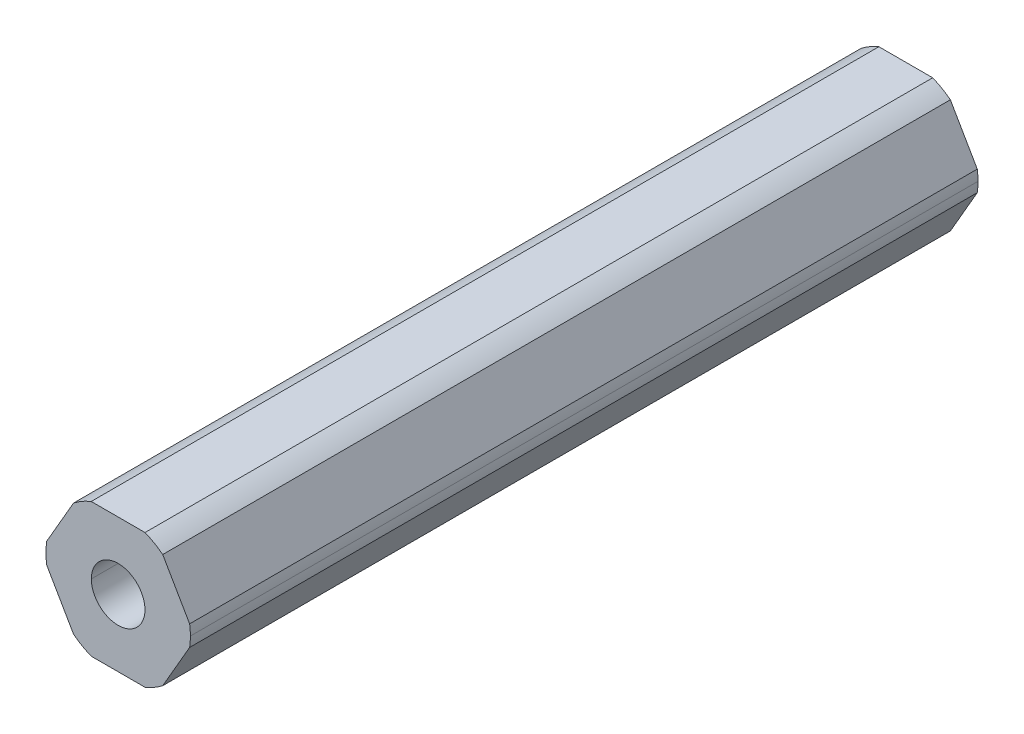
ISO-10303-21;
HEADER;
FILE_DESCRIPTION(('STEP AP214'),'2;1');
FILE_NAME('part.step','',(''),(''),'','','');
FILE_SCHEMA(('AUTOMOTIVE_DESIGN { 1 0 10303 214 1 1 1 1 }'));
ENDSEC;
DATA;
#1=APPLICATION_CONTEXT('core data for automotive mechanical design processes');
#2=APPLICATION_PROTOCOL_DEFINITION('international standard','automotive_design',2000,#1);
#3=PRODUCT_CONTEXT('',#1,'mechanical');
#4=PRODUCT('Part','Part','',(#3));
#5=PRODUCT_RELATED_PRODUCT_CATEGORY('part','',(#4));
#6=PRODUCT_DEFINITION_FORMATION('','',#4);
#7=PRODUCT_DEFINITION_CONTEXT('part definition',#1,'design');
#8=PRODUCT_DEFINITION('design','',#6,#7);
#9=PRODUCT_DEFINITION_SHAPE('','',#8);
#10=(LENGTH_UNIT() NAMED_UNIT(*) SI_UNIT(.MILLI.,.METRE.));
#11=(NAMED_UNIT(*) PLANE_ANGLE_UNIT() SI_UNIT($,.RADIAN.));
#12=(NAMED_UNIT(*) SI_UNIT($,.STERADIAN.) SOLID_ANGLE_UNIT());
#13=UNCERTAINTY_MEASURE_WITH_UNIT(LENGTH_MEASURE(1.E-05),#10,'distance_accuracy_value','');
#14=(GEOMETRIC_REPRESENTATION_CONTEXT(3) GLOBAL_UNCERTAINTY_ASSIGNED_CONTEXT((#13)) GLOBAL_UNIT_ASSIGNED_CONTEXT((#10,
#11,#12)) REPRESENTATION_CONTEXT('',''));
#15=CARTESIAN_POINT('',(0.,0.,0.));
#16=DIRECTION('',(0.,0.,1.));
#17=DIRECTION('',(1.,0.,0.));
#18=AXIS2_PLACEMENT_3D('',#15,#16,#17);
#19=CARTESIAN_POINT('',(0.,0.,-457.2));
#20=DIRECTION('',(0.,0.,1.));
#21=DIRECTION('',(1.,0.,0.));
#22=AXIS2_PLACEMENT_3D('',#19,#20,#21);
#23=CYLINDRICAL_SURFACE('',#22,2.55);
#24=CARTESIAN_POINT('',(0.,0.,-382.27));
#25=DIRECTION('',(0.,0.,1.));
#26=DIRECTION('',(1.,0.,0.));
#27=AXIS2_PLACEMENT_3D('',#24,#25,#26);
#28=CIRCLE('',#27,2.55);
#29=CARTESIAN_POINT('',(2.55,0.,-382.27));
#30=VERTEX_POINT('',#29);
#31=CARTESIAN_POINT('',(-2.55,0.,-382.27));
#32=VERTEX_POINT('',#31);
#33=EDGE_CURVE('E67',#30,#32,#28,.F.);
#34=ORIENTED_EDGE('',*,*,#33,.F.);
#35=DIRECTION('',(0.,0.,1.));
#36=VECTOR('',#35,1.);
#37=CARTESIAN_POINT('',(2.55,0.,-457.2));
#38=LINE('',#37,#36);
#39=CARTESIAN_POINT('',(2.55,0.,-457.2));
#40=VERTEX_POINT('',#39);
#41=EDGE_CURVE('E170',#40,#30,#38,.T.);
#42=ORIENTED_EDGE('',*,*,#41,.F.);
#43=CARTESIAN_POINT('',(0.,0.,-457.2));
#44=DIRECTION('',(0.,0.,1.));
#45=DIRECTION('',(1.,0.,0.));
#46=AXIS2_PLACEMENT_3D('',#43,#44,#45);
#47=CIRCLE('',#46,2.55);
#48=CARTESIAN_POINT('',(-2.55,0.,-457.2));
#49=VERTEX_POINT('',#48);
#50=EDGE_CURVE('E272',#49,#40,#47,.T.);
#51=ORIENTED_EDGE('',*,*,#50,.F.);
#52=DIRECTION('',(0.,0.,1.));
#53=VECTOR('',#52,1.);
#54=CARTESIAN_POINT('',(-2.55,0.,-457.2));
#55=LINE('',#54,#53);
#56=EDGE_CURVE('E54',#49,#32,#55,.T.);
#57=ORIENTED_EDGE('',*,*,#56,.T.);
#58=EDGE_LOOP('',(#34,#42,#51,#57));
#59=FACE_BOUND('',#58,.T.);
#60=ADVANCED_FACE('F46',(#59),#23,.F.);
#61=CARTESIAN_POINT('',(0.,0.,-457.2));
#62=DIRECTION('',(0.,0.,1.));
#63=DIRECTION('',(1.,0.,0.));
#64=AXIS2_PLACEMENT_3D('',#61,#62,#63);
#65=CYLINDRICAL_SURFACE('',#64,6.87);
#66=DIRECTION('',(0.,0.,1.));
#67=VECTOR('',#66,1.);
#68=CARTESIAN_POINT('',(6.87,0.,-457.2));
#69=LINE('',#68,#67);
#70=CARTESIAN_POINT('',(6.87,0.,-457.2));
#71=VERTEX_POINT('',#70);
#72=CARTESIAN_POINT('',(6.87,0.,-382.27));
#73=VERTEX_POINT('',#72);
#74=EDGE_CURVE('E219',#71,#73,#69,.T.);
#75=ORIENTED_EDGE('',*,*,#74,.T.);
#76=CARTESIAN_POINT('',(0.,0.,-382.27));
#77=DIRECTION('',(0.,0.,1.));
#78=DIRECTION('',(1.,0.,0.));
#79=AXIS2_PLACEMENT_3D('',#76,#77,#78);
#80=CIRCLE('',#79,6.87);
#81=CARTESIAN_POINT('',(6.80102150534208,-0.971085209378955,-382.27));
#82=VERTEX_POINT('',#81);
#83=EDGE_CURVE('E333',#73,#82,#80,.F.);
#84=ORIENTED_EDGE('',*,*,#83,.T.);
#85=DIRECTION('',(0.,0.,-1.));
#86=VECTOR('',#85,1.);
#87=CARTESIAN_POINT('',(6.80102150534208,-0.971085209378962,-457.2));
#88=LINE('',#87,#86);
#89=CARTESIAN_POINT('',(6.80102150534208,-0.971085209378955,-457.2));
#90=VERTEX_POINT('',#89);
#91=EDGE_CURVE('E222',#82,#90,#88,.T.);
#92=ORIENTED_EDGE('',*,*,#91,.T.);
#93=CARTESIAN_POINT('',(0.,0.,-457.2));
#94=DIRECTION('',(0.,0.,1.));
#95=DIRECTION('',(1.,0.,0.));
#96=AXIS2_PLACEMENT_3D('',#93,#94,#95);
#97=CIRCLE('',#96,6.87);
#98=EDGE_CURVE('E215',#90,#71,#97,.T.);
#99=ORIENTED_EDGE('',*,*,#98,.T.);
#100=EDGE_LOOP('',(#75,#84,#92,#99));
#101=FACE_BOUND('',#100,.T.);
#102=ADVANCED_FACE('F357',(#101),#65,.T.);
#103=CARTESIAN_POINT('',(3.68083890619154,-6.3754,457.2));
#104=DIRECTION('',(-0.866025403784439,0.5,0.));
#105=DIRECTION('',(0.,0.,1.));
#106=AXIS2_PLACEMENT_3D('',#103,#104,#105);
#107=PLANE('',#106);
#108=DIRECTION('',(0.5,0.866025403784439,0.));
#109=VECTOR('',#108,1.);
#110=CARTESIAN_POINT('',(3.68083890619154,-6.3754,-382.27));
#111=LINE('',#110,#109);
#112=CARTESIAN_POINT('',(4.24149521323254,-5.40431479062105,-382.27));
#113=VERTEX_POINT('',#112);
#114=EDGE_CURVE('E341',#113,#82,#111,.T.);
#115=ORIENTED_EDGE('',*,*,#114,.F.);
#116=DIRECTION('',(0.,0.,1.));
#117=VECTOR('',#116,1.);
#118=CARTESIAN_POINT('',(4.24149521323255,-5.40431479062104,-457.2));
#119=LINE('',#118,#117);
#120=CARTESIAN_POINT('',(4.24149521323254,-5.40431479062105,-457.2));
#121=VERTEX_POINT('',#120);
#122=EDGE_CURVE('E212',#121,#113,#119,.T.);
#123=ORIENTED_EDGE('',*,*,#122,.F.);
#124=DIRECTION('',(0.5,0.866025403784439,0.));
#125=VECTOR('',#124,1.);
#126=CARTESIAN_POINT('',(3.68083890619154,-6.3754,-457.2));
#127=LINE('',#126,#125);
#128=EDGE_CURVE('E240',#121,#90,#127,.T.);
#129=ORIENTED_EDGE('',*,*,#128,.T.);
#130=ORIENTED_EDGE('',*,*,#91,.F.);
#131=EDGE_LOOP('',(#115,#123,#129,#130));
#132=FACE_BOUND('',#131,.T.);
#133=ADVANCED_FACE('F355',(#132),#107,.F.);
#134=CARTESIAN_POINT('',(7.36167781238308,0.,457.2));
#135=DIRECTION('',(-0.866025403784439,-0.5,0.));
#136=DIRECTION('',(-0.5,0.866025403784439,0.));
#137=AXIS2_PLACEMENT_3D('',#134,#135,#136);
#138=PLANE('',#137);
#139=DIRECTION('',(-0.5,0.866025403784439,0.));
#140=VECTOR('',#139,1.);
#141=CARTESIAN_POINT('',(7.36167781238308,0.,-382.27));
#142=LINE('',#141,#140);
#143=CARTESIAN_POINT('',(6.80102150534208,0.97108520937895,-382.27));
#144=VERTEX_POINT('',#143);
#145=CARTESIAN_POINT('',(4.24149521323254,5.40431479062105,-382.27));
#146=VERTEX_POINT('',#145);
#147=EDGE_CURVE('E61',#144,#146,#142,.T.);
#148=ORIENTED_EDGE('',*,*,#147,.F.);
#149=DIRECTION('',(0.,0.,1.));
#150=VECTOR('',#149,1.);
#151=CARTESIAN_POINT('',(6.80102150534208,0.971085209378949,-457.2));
#152=LINE('',#151,#150);
#153=CARTESIAN_POINT('',(6.80102150534208,0.97108520937895,-457.2));
#154=VERTEX_POINT('',#153);
#155=EDGE_CURVE('E207',#154,#144,#152,.T.);
#156=ORIENTED_EDGE('',*,*,#155,.F.);
#157=DIRECTION('',(-0.5,0.866025403784439,0.));
#158=VECTOR('',#157,1.);
#159=CARTESIAN_POINT('',(7.36167781238308,0.,-457.2));
#160=LINE('',#159,#158);
#161=CARTESIAN_POINT('',(4.24149521323254,5.40431479062105,-457.2));
#162=VERTEX_POINT('',#161);
#163=EDGE_CURVE('E203',#154,#162,#160,.T.);
#164=ORIENTED_EDGE('',*,*,#163,.T.);
#165=DIRECTION('',(0.,0.,-1.));
#166=VECTOR('',#165,1.);
#167=CARTESIAN_POINT('',(4.24149521323254,5.40431479062105,-457.2));
#168=LINE('',#167,#166);
#169=EDGE_CURVE('E216',#146,#162,#168,.T.);
#170=ORIENTED_EDGE('',*,*,#169,.F.);
#171=EDGE_LOOP('',(#148,#156,#164,#170));
#172=FACE_BOUND('',#171,.T.);
#173=ADVANCED_FACE('F312',(#172),#138,.F.);
#174=CARTESIAN_POINT('',(3.68083890619154,6.3754,457.2));
#175=DIRECTION('',(0.,-1.,0.));
#176=DIRECTION('',(0.,0.,-1.));
#177=AXIS2_PLACEMENT_3D('',#174,#175,#176);
#178=PLANE('',#177);
#179=DIRECTION('',(-1.,0.,0.));
#180=VECTOR('',#179,1.);
#181=CARTESIAN_POINT('',(3.68083890619154,6.3754,-382.27));
#182=LINE('',#181,#180);
#183=CARTESIAN_POINT('',(2.55952629210953,6.3754,-382.27));
#184=VERTEX_POINT('',#183);
#185=CARTESIAN_POINT('',(-2.55952629210953,6.3754,-382.27));
#186=VERTEX_POINT('',#185);
#187=EDGE_CURVE('E321',#184,#186,#182,.T.);
#188=ORIENTED_EDGE('',*,*,#187,.F.);
#189=DIRECTION('',(0.,0.,1.));
#190=VECTOR('',#189,1.);
#191=CARTESIAN_POINT('',(2.55952629210952,6.3754,-457.2));
#192=LINE('',#191,#190);
#193=CARTESIAN_POINT('',(2.55952629210952,6.3754,-457.2));
#194=VERTEX_POINT('',#193);
#195=EDGE_CURVE('E179',#194,#184,#192,.T.);
#196=ORIENTED_EDGE('',*,*,#195,.F.);
#197=DIRECTION('',(-1.,0.,0.));
#198=VECTOR('',#197,1.);
#199=CARTESIAN_POINT('',(3.68083890619154,6.3754,-457.2));
#200=LINE('',#199,#198);
#201=CARTESIAN_POINT('',(-2.55952629210953,6.3754,-457.2));
#202=VERTEX_POINT('',#201);
#203=EDGE_CURVE('E199',#194,#202,#200,.T.);
#204=ORIENTED_EDGE('',*,*,#203,.T.);
#205=DIRECTION('',(0.,0.,-1.));
#206=VECTOR('',#205,1.);
#207=CARTESIAN_POINT('',(-2.55952629210953,6.3754,-457.2));
#208=LINE('',#207,#206);
#209=EDGE_CURVE('E198',#186,#202,#208,.T.);
#210=ORIENTED_EDGE('',*,*,#209,.F.);
#211=EDGE_LOOP('',(#188,#196,#204,#210));
#212=FACE_BOUND('',#211,.T.);
#213=ADVANCED_FACE('F48',(#212),#178,.F.);
#214=CARTESIAN_POINT('',(-3.68083890619154,6.3754,457.2));
#215=DIRECTION('',(0.866025403784439,-0.5,0.));
#216=DIRECTION('',(0.,0.,-1.));
#217=AXIS2_PLACEMENT_3D('',#214,#215,#216);
#218=PLANE('',#217);
#219=DIRECTION('',(-0.5,-0.866025403784439,0.));
#220=VECTOR('',#219,1.);
#221=CARTESIAN_POINT('',(-3.68083890619154,6.3754,-382.27));
#222=LINE('',#221,#220);
#223=CARTESIAN_POINT('',(-4.24149521323255,5.40431479062105,-382.27));
#224=VERTEX_POINT('',#223);
#225=CARTESIAN_POINT('',(-6.80102150534207,0.97108520937896,-382.27));
#226=VERTEX_POINT('',#225);
#227=EDGE_CURVE('E331',#224,#226,#222,.T.);
#228=ORIENTED_EDGE('',*,*,#227,.F.);
#229=DIRECTION('',(0.,0.,1.));
#230=VECTOR('',#229,1.);
#231=CARTESIAN_POINT('',(-4.24149521323255,5.40431479062105,-457.2));
#232=LINE('',#231,#230);
#233=CARTESIAN_POINT('',(-4.24149521323255,5.40431479062105,-457.2));
#234=VERTEX_POINT('',#233);
#235=EDGE_CURVE('E218',#234,#224,#232,.T.);
#236=ORIENTED_EDGE('',*,*,#235,.F.);
#237=DIRECTION('',(-0.5,-0.866025403784439,0.));
#238=VECTOR('',#237,1.);
#239=CARTESIAN_POINT('',(-3.68083890619154,6.3754,-457.2));
#240=LINE('',#239,#238);
#241=CARTESIAN_POINT('',(-6.80102150534208,0.97108520937896,-457.2));
#242=VERTEX_POINT('',#241);
#243=EDGE_CURVE('E204',#234,#242,#240,.T.);
#244=ORIENTED_EDGE('',*,*,#243,.T.);
#245=DIRECTION('',(0.,0.,-1.));
#246=VECTOR('',#245,1.);
#247=CARTESIAN_POINT('',(-6.80102150534208,0.97108520937896,-457.2));
#248=LINE('',#247,#246);
#249=EDGE_CURVE('E278',#226,#242,#248,.T.);
#250=ORIENTED_EDGE('',*,*,#249,.F.);
#251=EDGE_LOOP('',(#228,#236,#244,#250));
#252=FACE_BOUND('',#251,.T.);
#253=ADVANCED_FACE('F401',(#252),#218,.F.);
#254=CARTESIAN_POINT('',(-7.36167781238308,0.,457.2));
#255=DIRECTION('',(0.866025403784439,0.5,0.));
#256=DIRECTION('',(0.,0.,-1.));
#257=AXIS2_PLACEMENT_3D('',#254,#255,#256);
#258=PLANE('',#257);
#259=DIRECTION('',(0.5,-0.866025403784439,0.));
#260=VECTOR('',#259,1.);
#261=CARTESIAN_POINT('',(-7.36167781238308,0.,-382.27));
#262=LINE('',#261,#260);
#263=CARTESIAN_POINT('',(-6.80102150534208,-0.971085209378956,-382.27));
#264=VERTEX_POINT('',#263);
#265=CARTESIAN_POINT('',(-4.24149521323254,-5.40431479062105,-382.27));
#266=VERTEX_POINT('',#265);
#267=EDGE_CURVE('E339',#264,#266,#262,.T.);
#268=ORIENTED_EDGE('',*,*,#267,.F.);
#269=DIRECTION('',(0.,0.,1.));
#270=VECTOR('',#269,1.);
#271=CARTESIAN_POINT('',(-6.80102150534208,-0.971085209378962,-457.2));
#272=LINE('',#271,#270);
#273=CARTESIAN_POINT('',(-6.80102150534208,-0.971085209378956,-457.2));
#274=VERTEX_POINT('',#273);
#275=EDGE_CURVE('E194',#274,#264,#272,.T.);
#276=ORIENTED_EDGE('',*,*,#275,.F.);
#277=DIRECTION('',(0.5,-0.866025403784439,0.));
#278=VECTOR('',#277,1.);
#279=CARTESIAN_POINT('',(-7.36167781238308,0.,-457.2));
#280=LINE('',#279,#278);
#281=CARTESIAN_POINT('',(-4.24149521323254,-5.40431479062105,-457.2));
#282=VERTEX_POINT('',#281);
#283=EDGE_CURVE('E254',#274,#282,#280,.T.);
#284=ORIENTED_EDGE('',*,*,#283,.T.);
#285=DIRECTION('',(0.,0.,-1.));
#286=VECTOR('',#285,1.);
#287=CARTESIAN_POINT('',(-4.24149521323255,-5.40431479062104,-457.2));
#288=LINE('',#287,#286);
#289=EDGE_CURVE('E247',#266,#282,#288,.T.);
#290=ORIENTED_EDGE('',*,*,#289,.F.);
#291=EDGE_LOOP('',(#268,#276,#284,#290));
#292=FACE_BOUND('',#291,.T.);
#293=ADVANCED_FACE('F366',(#292),#258,.F.);
#294=CARTESIAN_POINT('',(-3.68083890619154,-6.3754,457.2));
#295=DIRECTION('',(0.,1.,0.));
#296=DIRECTION('',(1.,0.,0.));
#297=AXIS2_PLACEMENT_3D('',#294,#295,#296);
#298=PLANE('',#297);
#299=DIRECTION('',(1.,0.,0.));
#300=VECTOR('',#299,1.);
#301=CARTESIAN_POINT('',(-3.68083890619154,-6.3754,-382.27));
#302=LINE('',#301,#300);
#303=CARTESIAN_POINT('',(-2.55952629210953,-6.3754,-382.27));
#304=VERTEX_POINT('',#303);
#305=CARTESIAN_POINT('',(2.55952629210953,-6.3754,-382.27));
#306=VERTEX_POINT('',#305);
#307=EDGE_CURVE('E180',#304,#306,#302,.T.);
#308=ORIENTED_EDGE('',*,*,#307,.F.);
#309=DIRECTION('',(0.,0.,1.));
#310=VECTOR('',#309,1.);
#311=CARTESIAN_POINT('',(-2.55952629210953,-6.3754,-457.2));
#312=LINE('',#311,#310);
#313=CARTESIAN_POINT('',(-2.55952629210953,-6.3754,-457.2));
#314=VERTEX_POINT('',#313);
#315=EDGE_CURVE('E248',#314,#304,#312,.T.);
#316=ORIENTED_EDGE('',*,*,#315,.F.);
#317=DIRECTION('',(1.,0.,0.));
#318=VECTOR('',#317,1.);
#319=CARTESIAN_POINT('',(-3.68083890619154,-6.3754,-457.2));
#320=LINE('',#319,#318);
#321=CARTESIAN_POINT('',(2.55952629210953,-6.3754,-457.2));
#322=VERTEX_POINT('',#321);
#323=EDGE_CURVE('E257',#314,#322,#320,.T.);
#324=ORIENTED_EDGE('',*,*,#323,.T.);
#325=DIRECTION('',(0.,0.,-1.));
#326=VECTOR('',#325,1.);
#327=CARTESIAN_POINT('',(2.55952629210953,-6.3754,-457.2));
#328=LINE('',#327,#326);
#329=EDGE_CURVE('E291',#306,#322,#328,.T.);
#330=ORIENTED_EDGE('',*,*,#329,.F.);
#331=EDGE_LOOP('',(#308,#316,#324,#330));
#332=FACE_BOUND('',#331,.T.);
#333=ADVANCED_FACE('F348',(#332),#298,.F.);
#334=CARTESIAN_POINT('',(0.,0.,-457.2));
#335=DIRECTION('',(0.,0.,1.));
#336=DIRECTION('',(1.,0.,0.));
#337=AXIS2_PLACEMENT_3D('',#334,#335,#336);
#338=CYLINDRICAL_SURFACE('',#337,6.87);
#339=ORIENTED_EDGE('',*,*,#155,.T.);
#340=CARTESIAN_POINT('',(0.,0.,-382.27));
#341=DIRECTION('',(0.,0.,1.));
#342=DIRECTION('',(1.,0.,0.));
#343=AXIS2_PLACEMENT_3D('',#340,#341,#342);
#344=CIRCLE('',#343,6.87);
#345=EDGE_CURVE('E328',#144,#73,#344,.F.);
#346=ORIENTED_EDGE('',*,*,#345,.T.);
#347=ORIENTED_EDGE('',*,*,#74,.F.);
#348=CARTESIAN_POINT('',(0.,0.,-457.2));
#349=DIRECTION('',(0.,0.,1.));
#350=DIRECTION('',(1.,0.,0.));
#351=AXIS2_PLACEMENT_3D('',#348,#349,#350);
#352=CIRCLE('',#351,6.87);
#353=EDGE_CURVE('E211',#71,#154,#352,.T.);
#354=ORIENTED_EDGE('',*,*,#353,.T.);
#355=EDGE_LOOP('',(#339,#346,#347,#354));
#356=FACE_BOUND('',#355,.T.);
#357=ADVANCED_FACE('F358',(#356),#338,.T.);
#358=CARTESIAN_POINT('',(0.,0.,-457.2));
#359=DIRECTION('',(0.,0.,1.));
#360=DIRECTION('',(1.,0.,0.));
#361=AXIS2_PLACEMENT_3D('',#358,#359,#360);
#362=CYLINDRICAL_SURFACE('',#361,6.87);
#363=ORIENTED_EDGE('',*,*,#122,.T.);
#364=CARTESIAN_POINT('',(0.,0.,-382.27));
#365=DIRECTION('',(0.,0.,1.));
#366=DIRECTION('',(1.,0.,0.));
#367=AXIS2_PLACEMENT_3D('',#364,#365,#366);
#368=CIRCLE('',#367,6.87);
#369=EDGE_CURVE('E189',#113,#306,#368,.F.);
#370=ORIENTED_EDGE('',*,*,#369,.T.);
#371=ORIENTED_EDGE('',*,*,#329,.T.);
#372=CARTESIAN_POINT('',(0.,0.,-457.2));
#373=DIRECTION('',(0.,0.,1.));
#374=DIRECTION('',(1.,0.,0.));
#375=AXIS2_PLACEMENT_3D('',#372,#373,#374);
#376=CIRCLE('',#375,6.87);
#377=EDGE_CURVE('E238',#322,#121,#376,.T.);
#378=ORIENTED_EDGE('',*,*,#377,.T.);
#379=EDGE_LOOP('',(#363,#370,#371,#378));
#380=FACE_BOUND('',#379,.T.);
#381=ADVANCED_FACE('F345',(#380),#362,.T.);
#382=CARTESIAN_POINT('',(0.,0.,-457.2));
#383=DIRECTION('',(0.,0.,1.));
#384=DIRECTION('',(1.,0.,0.));
#385=AXIS2_PLACEMENT_3D('',#382,#383,#384);
#386=CYLINDRICAL_SURFACE('',#385,6.87);
#387=ORIENTED_EDGE('',*,*,#315,.T.);
#388=CARTESIAN_POINT('',(0.,0.,-382.27));
#389=DIRECTION('',(0.,0.,1.));
#390=DIRECTION('',(1.,0.,0.));
#391=AXIS2_PLACEMENT_3D('',#388,#389,#390);
#392=CIRCLE('',#391,6.87);
#393=EDGE_CURVE('E343',#304,#266,#392,.F.);
#394=ORIENTED_EDGE('',*,*,#393,.T.);
#395=ORIENTED_EDGE('',*,*,#289,.T.);
#396=CARTESIAN_POINT('',(0.,0.,-457.2));
#397=DIRECTION('',(0.,0.,1.));
#398=DIRECTION('',(1.,0.,0.));
#399=AXIS2_PLACEMENT_3D('',#396,#397,#398);
#400=CIRCLE('',#399,6.87);
#401=EDGE_CURVE('E243',#282,#314,#400,.T.);
#402=ORIENTED_EDGE('',*,*,#401,.T.);
#403=EDGE_LOOP('',(#387,#394,#395,#402));
#404=FACE_BOUND('',#403,.T.);
#405=ADVANCED_FACE('F349',(#404),#386,.T.);
#406=CARTESIAN_POINT('',(0.,0.,-457.2));
#407=DIRECTION('',(0.,0.,1.));
#408=DIRECTION('',(1.,0.,0.));
#409=AXIS2_PLACEMENT_3D('',#406,#407,#408);
#410=CYLINDRICAL_SURFACE('',#409,6.87);
#411=ORIENTED_EDGE('',*,*,#275,.T.);
#412=CARTESIAN_POINT('',(0.,0.,-382.27));
#413=DIRECTION('',(0.,0.,1.));
#414=DIRECTION('',(1.,0.,0.));
#415=AXIS2_PLACEMENT_3D('',#412,#413,#414);
#416=CIRCLE('',#415,6.87);
#417=EDGE_CURVE('E336',#264,#226,#416,.F.);
#418=ORIENTED_EDGE('',*,*,#417,.T.);
#419=ORIENTED_EDGE('',*,*,#249,.T.);
#420=CARTESIAN_POINT('',(0.,0.,-457.2));
#421=DIRECTION('',(0.,0.,1.));
#422=DIRECTION('',(1.,0.,0.));
#423=AXIS2_PLACEMENT_3D('',#420,#421,#422);
#424=CIRCLE('',#423,6.87);
#425=EDGE_CURVE('E197',#242,#274,#424,.T.);
#426=ORIENTED_EDGE('',*,*,#425,.T.);
#427=EDGE_LOOP('',(#411,#418,#419,#426));
#428=FACE_BOUND('',#427,.T.);
#429=ADVANCED_FACE('F390',(#428),#410,.T.);
#430=CARTESIAN_POINT('',(0.,0.,-457.2));
#431=DIRECTION('',(0.,0.,1.));
#432=DIRECTION('',(1.,0.,0.));
#433=AXIS2_PLACEMENT_3D('',#430,#431,#432);
#434=CYLINDRICAL_SURFACE('',#433,6.87);
#435=ORIENTED_EDGE('',*,*,#235,.T.);
#436=CARTESIAN_POINT('',(0.,0.,-382.27));
#437=DIRECTION('',(0.,0.,1.));
#438=DIRECTION('',(1.,0.,0.));
#439=AXIS2_PLACEMENT_3D('',#436,#437,#438);
#440=CIRCLE('',#439,6.87);
#441=EDGE_CURVE('E326',#224,#186,#440,.F.);
#442=ORIENTED_EDGE('',*,*,#441,.T.);
#443=ORIENTED_EDGE('',*,*,#209,.T.);
#444=CARTESIAN_POINT('',(0.,0.,-457.2));
#445=DIRECTION('',(0.,0.,1.));
#446=DIRECTION('',(1.,0.,0.));
#447=AXIS2_PLACEMENT_3D('',#444,#445,#446);
#448=CIRCLE('',#447,6.87);
#449=EDGE_CURVE('E206',#202,#234,#448,.T.);
#450=ORIENTED_EDGE('',*,*,#449,.T.);
#451=EDGE_LOOP('',(#435,#442,#443,#450));
#452=FACE_BOUND('',#451,.T.);
#453=ADVANCED_FACE('F386',(#452),#434,.T.);
#454=CARTESIAN_POINT('',(0.,0.,-457.2));
#455=DIRECTION('',(0.,0.,1.));
#456=DIRECTION('',(1.,0.,0.));
#457=AXIS2_PLACEMENT_3D('',#454,#455,#456);
#458=CYLINDRICAL_SURFACE('',#457,6.87);
#459=ORIENTED_EDGE('',*,*,#195,.T.);
#460=CARTESIAN_POINT('',(0.,0.,-382.27));
#461=DIRECTION('',(0.,0.,1.));
#462=DIRECTION('',(1.,0.,0.));
#463=AXIS2_PLACEMENT_3D('',#460,#461,#462);
#464=CIRCLE('',#463,6.87);
#465=EDGE_CURVE('E172',#184,#146,#464,.F.);
#466=ORIENTED_EDGE('',*,*,#465,.T.);
#467=ORIENTED_EDGE('',*,*,#169,.T.);
#468=CARTESIAN_POINT('',(0.,0.,-457.2));
#469=DIRECTION('',(0.,0.,1.));
#470=DIRECTION('',(1.,0.,0.));
#471=AXIS2_PLACEMENT_3D('',#468,#469,#470);
#472=CIRCLE('',#471,6.87);
#473=EDGE_CURVE('E187',#162,#194,#472,.T.);
#474=ORIENTED_EDGE('',*,*,#473,.T.);
#475=EDGE_LOOP('',(#459,#466,#467,#474));
#476=FACE_BOUND('',#475,.T.);
#477=ADVANCED_FACE('F319',(#476),#458,.T.);
#478=CARTESIAN_POINT('',(0.,0.,-457.2));
#479=DIRECTION('',(0.,0.,1.));
#480=DIRECTION('',(1.,0.,0.));
#481=AXIS2_PLACEMENT_3D('',#478,#479,#480);
#482=CYLINDRICAL_SURFACE('',#481,2.55);
#483=CARTESIAN_POINT('',(0.,0.,-382.27));
#484=DIRECTION('',(0.,0.,1.));
#485=DIRECTION('',(1.,0.,0.));
#486=AXIS2_PLACEMENT_3D('',#483,#484,#485);
#487=CIRCLE('',#486,2.55);
#488=EDGE_CURVE('E12',#32,#30,#487,.F.);
#489=ORIENTED_EDGE('',*,*,#488,.F.);
#490=ORIENTED_EDGE('',*,*,#56,.F.);
#491=CARTESIAN_POINT('',(0.,0.,-457.2));
#492=DIRECTION('',(0.,0.,1.));
#493=DIRECTION('',(1.,0.,0.));
#494=AXIS2_PLACEMENT_3D('',#491,#492,#493);
#495=CIRCLE('',#494,2.55);
#496=EDGE_CURVE('E177',#40,#49,#495,.T.);
#497=ORIENTED_EDGE('',*,*,#496,.F.);
#498=ORIENTED_EDGE('',*,*,#41,.T.);
#499=EDGE_LOOP('',(#489,#490,#497,#498));
#500=FACE_BOUND('',#499,.T.);
#501=ADVANCED_FACE('F175',(#500),#482,.F.);
#502=CARTESIAN_POINT('',(0.,0.,-457.2));
#503=DIRECTION('',(0.,0.,1.));
#504=DIRECTION('',(1.,0.,0.));
#505=AXIS2_PLACEMENT_3D('',#502,#503,#504);
#506=PLANE('',#505);
#507=ORIENTED_EDGE('',*,*,#473,.F.);
#508=ORIENTED_EDGE('',*,*,#163,.F.);
#509=ORIENTED_EDGE('',*,*,#353,.F.);
#510=ORIENTED_EDGE('',*,*,#98,.F.);
#511=ORIENTED_EDGE('',*,*,#128,.F.);
#512=ORIENTED_EDGE('',*,*,#377,.F.);
#513=ORIENTED_EDGE('',*,*,#323,.F.);
#514=ORIENTED_EDGE('',*,*,#401,.F.);
#515=ORIENTED_EDGE('',*,*,#283,.F.);
#516=ORIENTED_EDGE('',*,*,#425,.F.);
#517=ORIENTED_EDGE('',*,*,#243,.F.);
#518=ORIENTED_EDGE('',*,*,#449,.F.);
#519=ORIENTED_EDGE('',*,*,#203,.F.);
#520=EDGE_LOOP('',(#507,#508,#509,#510,#511,#512,#513,#514,#515,#516,#517,#518,#519));
#521=FACE_BOUND('',#520,.T.);
#522=ORIENTED_EDGE('',*,*,#496,.T.);
#523=ORIENTED_EDGE('',*,*,#50,.T.);
#524=EDGE_LOOP('',(#522,#523));
#525=FACE_BOUND('',#524,.T.);
#526=ADVANCED_FACE('F316',(#521,#525),#506,.F.);
#527=CARTESIAN_POINT('',(0.,0.,-382.27));
#528=DIRECTION('',(0.,0.,1.));
#529=DIRECTION('',(1.,0.,0.));
#530=AXIS2_PLACEMENT_3D('',#527,#528,#529);
#531=PLANE('',#530);
#532=ORIENTED_EDGE('',*,*,#33,.T.);
#533=ORIENTED_EDGE('',*,*,#488,.T.);
#534=EDGE_LOOP('',(#532,#533));
#535=FACE_BOUND('',#534,.T.);
#536=ORIENTED_EDGE('',*,*,#307,.T.);
#537=ORIENTED_EDGE('',*,*,#369,.F.);
#538=ORIENTED_EDGE('',*,*,#114,.T.);
#539=ORIENTED_EDGE('',*,*,#83,.F.);
#540=ORIENTED_EDGE('',*,*,#345,.F.);
#541=ORIENTED_EDGE('',*,*,#147,.T.);
#542=ORIENTED_EDGE('',*,*,#465,.F.);
#543=ORIENTED_EDGE('',*,*,#187,.T.);
#544=ORIENTED_EDGE('',*,*,#441,.F.);
#545=ORIENTED_EDGE('',*,*,#227,.T.);
#546=ORIENTED_EDGE('',*,*,#417,.F.);
#547=ORIENTED_EDGE('',*,*,#267,.T.);
#548=ORIENTED_EDGE('',*,*,#393,.F.);
#549=EDGE_LOOP('',(#536,#537,#538,#539,#540,#541,#542,#543,#544,#545,#546,#547,#548));
#550=FACE_BOUND('',#549,.T.);
#551=ADVANCED_FACE('F164',(#535,#550),#531,.T.);
#552=CLOSED_SHELL('',(#60,#102,#133,#173,#213,#253,#293,#333,#357,#381,#405,#429,#453,#477,#501,
#526,#551));
#553=MANIFOLD_SOLID_BREP('B2',#552);
#554=ADVANCED_BREP_SHAPE_REPRESENTATION('',(#18,#553),#14);
#555=SHAPE_DEFINITION_REPRESENTATION(#9,#554);
ENDSEC;
END-ISO-10303-21;
